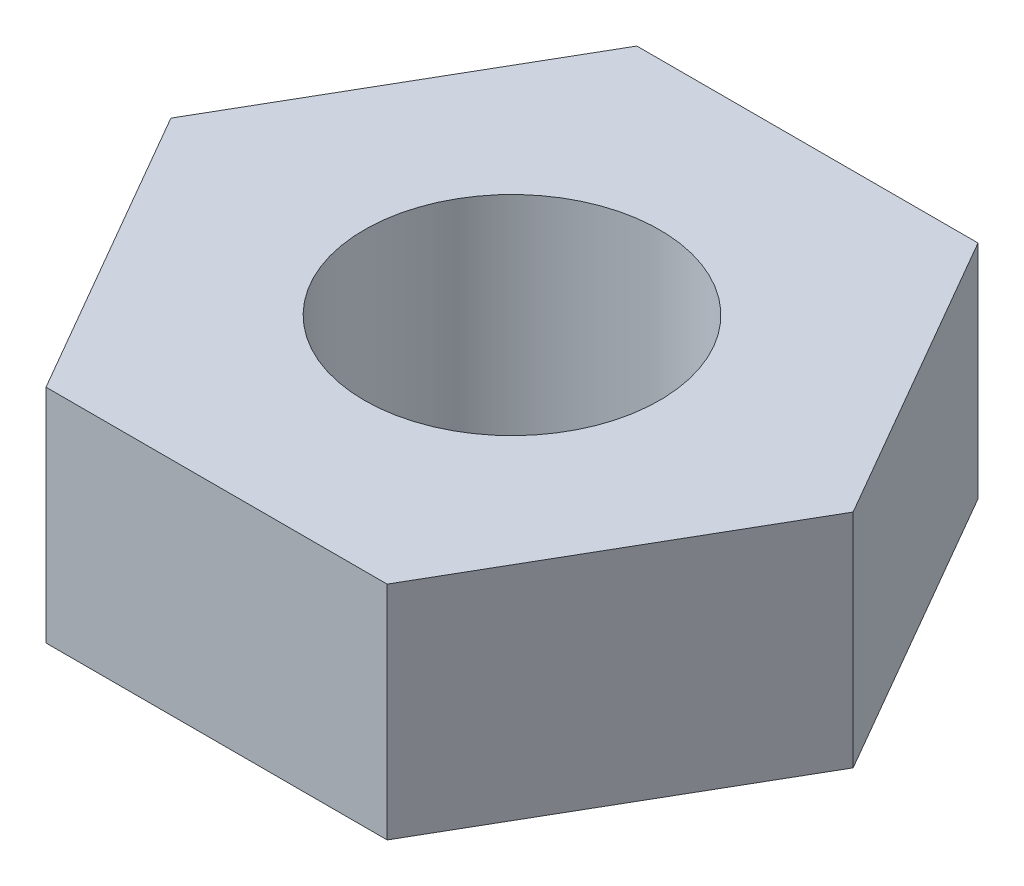
ISO-10303-21;
HEADER;
FILE_DESCRIPTION(('STEP AP214'),'2;1');
FILE_NAME('part.step','',(''),(''),'','','');
FILE_SCHEMA(('AUTOMOTIVE_DESIGN { 1 0 10303 214 1 1 1 1 }'));
ENDSEC;
DATA;
#1=APPLICATION_CONTEXT('core data for automotive mechanical design processes');
#2=APPLICATION_PROTOCOL_DEFINITION('international standard','automotive_design',2000,#1);
#3=PRODUCT_CONTEXT('',#1,'mechanical');
#4=PRODUCT('Part','Part','',(#3));
#5=PRODUCT_RELATED_PRODUCT_CATEGORY('part','',(#4));
#6=PRODUCT_DEFINITION_FORMATION('','',#4);
#7=PRODUCT_DEFINITION_CONTEXT('part definition',#1,'design');
#8=PRODUCT_DEFINITION('design','',#6,#7);
#9=PRODUCT_DEFINITION_SHAPE('','',#8);
#10=(LENGTH_UNIT() NAMED_UNIT(*) SI_UNIT(.MILLI.,.METRE.));
#11=(NAMED_UNIT(*) PLANE_ANGLE_UNIT() SI_UNIT($,.RADIAN.));
#12=(NAMED_UNIT(*) SI_UNIT($,.STERADIAN.) SOLID_ANGLE_UNIT());
#13=UNCERTAINTY_MEASURE_WITH_UNIT(LENGTH_MEASURE(1.E-05),#10,'distance_accuracy_value','');
#14=(GEOMETRIC_REPRESENTATION_CONTEXT(3) GLOBAL_UNCERTAINTY_ASSIGNED_CONTEXT((#13)) GLOBAL_UNIT_ASSIGNED_CONTEXT((#10,
#11,#12)) REPRESENTATION_CONTEXT('',''));
#15=CARTESIAN_POINT('',(0.,0.,0.));
#16=DIRECTION('',(0.,0.,1.));
#17=DIRECTION('',(1.,0.,0.));
#18=AXIS2_PLACEMENT_3D('',#15,#16,#17);
#19=CARTESIAN_POINT('',(0.,1.5,0.));
#20=DIRECTION('',(0.,1.,0.));
#21=DIRECTION('',(0.,0.,1.));
#22=AXIS2_PLACEMENT_3D('',#19,#20,#21);
#23=PLANE('',#22);
#24=DIRECTION('',(0.499999999999999,0.,-0.866025403784439));
#25=VECTOR('',#24,1.);
#26=CARTESIAN_POINT('',(1.15470053837925,1.5,2.));
#27=LINE('',#26,#25);
#28=CARTESIAN_POINT('',(1.15470053837925,1.5,2.));
#29=VERTEX_POINT('',#28);
#30=CARTESIAN_POINT('',(2.3094010767585,1.5,0.));
#31=VERTEX_POINT('',#30);
#32=EDGE_CURVE('E146',#29,#31,#27,.T.);
#33=ORIENTED_EDGE('',*,*,#32,.T.);
#34=DIRECTION('',(-0.5,0.,-0.866025403784439));
#35=VECTOR('',#34,1.);
#36=CARTESIAN_POINT('',(2.3094010767585,1.5,0.));
#37=LINE('',#36,#35);
#38=CARTESIAN_POINT('',(1.15470053837925,1.5,-2.));
#39=VERTEX_POINT('',#38);
#40=EDGE_CURVE('E94',#31,#39,#37,.T.);
#41=ORIENTED_EDGE('',*,*,#40,.T.);
#42=DIRECTION('',(-1.,0.,0.));
#43=VECTOR('',#42,1.);
#44=CARTESIAN_POINT('',(1.15470053837925,1.5,-2.));
#45=LINE('',#44,#43);
#46=CARTESIAN_POINT('',(-1.15470053837925,1.5,-2.));
#47=VERTEX_POINT('',#46);
#48=EDGE_CURVE('E107',#39,#47,#45,.T.);
#49=ORIENTED_EDGE('',*,*,#48,.T.);
#50=DIRECTION('',(-0.5,0.,0.866025403784439));
#51=VECTOR('',#50,1.);
#52=CARTESIAN_POINT('',(-1.15470053837925,1.5,-2.));
#53=LINE('',#52,#51);
#54=CARTESIAN_POINT('',(-2.3094010767585,1.5,0.));
#55=VERTEX_POINT('',#54);
#56=EDGE_CURVE('E101',#47,#55,#53,.T.);
#57=ORIENTED_EDGE('',*,*,#56,.T.);
#58=DIRECTION('',(0.5,0.,0.866025403784439));
#59=VECTOR('',#58,1.);
#60=CARTESIAN_POINT('',(-2.3094010767585,1.5,0.));
#61=LINE('',#60,#59);
#62=CARTESIAN_POINT('',(-1.15470053837925,1.5,2.));
#63=VERTEX_POINT('',#62);
#64=EDGE_CURVE('E105',#55,#63,#61,.T.);
#65=ORIENTED_EDGE('',*,*,#64,.T.);
#66=DIRECTION('',(1.,0.,0.));
#67=VECTOR('',#66,1.);
#68=CARTESIAN_POINT('',(-1.15470053837925,1.5,2.));
#69=LINE('',#68,#67);
#70=EDGE_CURVE('E57',#63,#29,#69,.T.);
#71=ORIENTED_EDGE('',*,*,#70,.T.);
#72=EDGE_LOOP('',(#33,#41,#49,#57,#65,#71));
#73=FACE_BOUND('',#72,.T.);
#74=CARTESIAN_POINT('',(0.,1.5,0.));
#75=DIRECTION('',(0.,1.,0.));
#76=DIRECTION('',(0.,0.,1.));
#77=AXIS2_PLACEMENT_3D('',#74,#75,#76);
#78=CIRCLE('',#77,1.);
#79=CARTESIAN_POINT('',(0.,1.5,1.));
#80=VERTEX_POINT('',#79);
#81=EDGE_CURVE('E134',#80,#80,#78,.T.);
#82=ORIENTED_EDGE('',*,*,#81,.F.);
#83=EDGE_LOOP('',(#82));
#84=FACE_BOUND('',#83,.T.);
#85=ADVANCED_FACE('F39',(#73,#84),#23,.T.);
#86=CARTESIAN_POINT('',(0.,0.,0.));
#87=DIRECTION('',(0.,1.,0.));
#88=DIRECTION('',(0.,0.,1.));
#89=AXIS2_PLACEMENT_3D('',#86,#87,#88);
#90=PLANE('',#89);
#91=DIRECTION('',(0.499999999999999,0.,-0.866025403784439));
#92=VECTOR('',#91,1.);
#93=CARTESIAN_POINT('',(1.15470053837925,0.,2.));
#94=LINE('',#93,#92);
#95=CARTESIAN_POINT('',(1.15470053837925,0.,2.));
#96=VERTEX_POINT('',#95);
#97=CARTESIAN_POINT('',(2.3094010767585,0.,0.));
#98=VERTEX_POINT('',#97);
#99=EDGE_CURVE('E129',#96,#98,#94,.T.);
#100=ORIENTED_EDGE('',*,*,#99,.F.);
#101=DIRECTION('',(1.,0.,0.));
#102=VECTOR('',#101,1.);
#103=CARTESIAN_POINT('',(-1.15470053837925,0.,2.));
#104=LINE('',#103,#102);
#105=CARTESIAN_POINT('',(-1.15470053837925,0.,2.));
#106=VERTEX_POINT('',#105);
#107=EDGE_CURVE('E86',#106,#96,#104,.T.);
#108=ORIENTED_EDGE('',*,*,#107,.F.);
#109=DIRECTION('',(0.5,0.,0.866025403784439));
#110=VECTOR('',#109,1.);
#111=CARTESIAN_POINT('',(-2.3094010767585,0.,0.));
#112=LINE('',#111,#110);
#113=CARTESIAN_POINT('',(-2.3094010767585,0.,0.));
#114=VERTEX_POINT('',#113);
#115=EDGE_CURVE('E80',#114,#106,#112,.T.);
#116=ORIENTED_EDGE('',*,*,#115,.F.);
#117=DIRECTION('',(-0.5,0.,0.866025403784439));
#118=VECTOR('',#117,1.);
#119=CARTESIAN_POINT('',(-1.15470053837925,0.,-2.));
#120=LINE('',#119,#118);
#121=CARTESIAN_POINT('',(-1.15470053837925,0.,-2.));
#122=VERTEX_POINT('',#121);
#123=EDGE_CURVE('E116',#122,#114,#120,.T.);
#124=ORIENTED_EDGE('',*,*,#123,.F.);
#125=DIRECTION('',(-1.,0.,0.));
#126=VECTOR('',#125,1.);
#127=CARTESIAN_POINT('',(1.15470053837925,0.,-2.));
#128=LINE('',#127,#126);
#129=CARTESIAN_POINT('',(1.15470053837925,0.,-2.));
#130=VERTEX_POINT('',#129);
#131=EDGE_CURVE('E137',#130,#122,#128,.T.);
#132=ORIENTED_EDGE('',*,*,#131,.F.);
#133=DIRECTION('',(-0.5,0.,-0.866025403784439));
#134=VECTOR('',#133,1.);
#135=CARTESIAN_POINT('',(2.3094010767585,0.,0.));
#136=LINE('',#135,#134);
#137=EDGE_CURVE('E133',#98,#130,#136,.T.);
#138=ORIENTED_EDGE('',*,*,#137,.F.);
#139=EDGE_LOOP('',(#100,#108,#116,#124,#132,#138));
#140=FACE_BOUND('',#139,.T.);
#141=CARTESIAN_POINT('',(0.,0.,0.));
#142=DIRECTION('',(0.,1.,0.));
#143=DIRECTION('',(0.,0.,1.));
#144=AXIS2_PLACEMENT_3D('',#141,#142,#143);
#145=CIRCLE('',#144,1.);
#146=CARTESIAN_POINT('',(0.,0.,1.));
#147=VERTEX_POINT('',#146);
#148=EDGE_CURVE('E243',#147,#147,#145,.T.);
#149=ORIENTED_EDGE('',*,*,#148,.T.);
#150=EDGE_LOOP('',(#149));
#151=FACE_BOUND('',#150,.T.);
#152=ADVANCED_FACE('F159',(#140,#151),#90,.F.);
#153=CARTESIAN_POINT('',(1.15470053837925,1.5,2.));
#154=DIRECTION('',(-0.866025403784439,0.,-0.499999999999999));
#155=DIRECTION('',(-0.499999999999999,0.,0.866025403784439));
#156=AXIS2_PLACEMENT_3D('',#153,#154,#155);
#157=PLANE('',#156);
#158=ORIENTED_EDGE('',*,*,#99,.T.);
#159=DIRECTION('',(0.,-1.,0.));
#160=VECTOR('',#159,1.);
#161=CARTESIAN_POINT('',(2.3094010767585,1.5,0.));
#162=LINE('',#161,#160);
#163=EDGE_CURVE('E11',#31,#98,#162,.T.);
#164=ORIENTED_EDGE('',*,*,#163,.F.);
#165=ORIENTED_EDGE('',*,*,#32,.F.);
#166=DIRECTION('',(0.,-1.,0.));
#167=VECTOR('',#166,1.);
#168=CARTESIAN_POINT('',(1.15470053837925,1.5,2.));
#169=LINE('',#168,#167);
#170=EDGE_CURVE('E125',#29,#96,#169,.T.);
#171=ORIENTED_EDGE('',*,*,#170,.T.);
#172=EDGE_LOOP('',(#158,#164,#165,#171));
#173=FACE_BOUND('',#172,.T.);
#174=ADVANCED_FACE('F41',(#173),#157,.F.);
#175=CARTESIAN_POINT('',(2.3094010767585,1.5,0.));
#176=DIRECTION('',(-0.866025403784438,0.,0.5));
#177=DIRECTION('',(0.5,0.,0.866025403784439));
#178=AXIS2_PLACEMENT_3D('',#175,#176,#177);
#179=PLANE('',#178);
#180=ORIENTED_EDGE('',*,*,#137,.T.);
#181=DIRECTION('',(0.,-1.,0.));
#182=VECTOR('',#181,1.);
#183=CARTESIAN_POINT('',(1.15470053837925,1.5,-2.));
#184=LINE('',#183,#182);
#185=EDGE_CURVE('E49',#39,#130,#184,.T.);
#186=ORIENTED_EDGE('',*,*,#185,.F.);
#187=ORIENTED_EDGE('',*,*,#40,.F.);
#188=ORIENTED_EDGE('',*,*,#163,.T.);
#189=EDGE_LOOP('',(#180,#186,#187,#188));
#190=FACE_BOUND('',#189,.T.);
#191=ADVANCED_FACE('F184',(#190),#179,.F.);
#192=CARTESIAN_POINT('',(1.15470053837925,1.5,-2.));
#193=DIRECTION('',(0.,0.,1.));
#194=DIRECTION('',(1.,0.,0.));
#195=AXIS2_PLACEMENT_3D('',#192,#193,#194);
#196=PLANE('',#195);
#197=ORIENTED_EDGE('',*,*,#131,.T.);
#198=DIRECTION('',(0.,-1.,0.));
#199=VECTOR('',#198,1.);
#200=CARTESIAN_POINT('',(-1.15470053837925,1.5,-2.));
#201=LINE('',#200,#199);
#202=EDGE_CURVE('E118',#47,#122,#201,.T.);
#203=ORIENTED_EDGE('',*,*,#202,.F.);
#204=ORIENTED_EDGE('',*,*,#48,.F.);
#205=ORIENTED_EDGE('',*,*,#185,.T.);
#206=EDGE_LOOP('',(#197,#203,#204,#205));
#207=FACE_BOUND('',#206,.T.);
#208=ADVANCED_FACE('F156',(#207),#196,.F.);
#209=CARTESIAN_POINT('',(-1.15470053837925,1.5,-2.));
#210=DIRECTION('',(0.866025403784439,0.,0.5));
#211=DIRECTION('',(0.5,0.,-0.866025403784439));
#212=AXIS2_PLACEMENT_3D('',#209,#210,#211);
#213=PLANE('',#212);
#214=ORIENTED_EDGE('',*,*,#123,.T.);
#215=DIRECTION('',(0.,-1.,0.));
#216=VECTOR('',#215,1.);
#217=CARTESIAN_POINT('',(-2.3094010767585,1.5,0.));
#218=LINE('',#217,#216);
#219=EDGE_CURVE('E113',#55,#114,#218,.T.);
#220=ORIENTED_EDGE('',*,*,#219,.F.);
#221=ORIENTED_EDGE('',*,*,#56,.F.);
#222=ORIENTED_EDGE('',*,*,#202,.T.);
#223=EDGE_LOOP('',(#214,#220,#221,#222));
#224=FACE_BOUND('',#223,.T.);
#225=ADVANCED_FACE('F114',(#224),#213,.F.);
#226=CARTESIAN_POINT('',(-2.3094010767585,1.5,0.));
#227=DIRECTION('',(0.866025403784439,0.,-0.5));
#228=DIRECTION('',(-0.5,0.,-0.866025403784439));
#229=AXIS2_PLACEMENT_3D('',#226,#227,#228);
#230=PLANE('',#229);
#231=ORIENTED_EDGE('',*,*,#115,.T.);
#232=DIRECTION('',(0.,-1.,0.));
#233=VECTOR('',#232,1.);
#234=CARTESIAN_POINT('',(-1.15470053837925,1.5,2.));
#235=LINE('',#234,#233);
#236=EDGE_CURVE('E119',#63,#106,#235,.T.);
#237=ORIENTED_EDGE('',*,*,#236,.F.);
#238=ORIENTED_EDGE('',*,*,#64,.F.);
#239=ORIENTED_EDGE('',*,*,#219,.T.);
#240=EDGE_LOOP('',(#231,#237,#238,#239));
#241=FACE_BOUND('',#240,.T.);
#242=ADVANCED_FACE('F121',(#241),#230,.F.);
#243=CARTESIAN_POINT('',(-1.15470053837925,1.5,2.));
#244=DIRECTION('',(0.,0.,-1.));
#245=DIRECTION('',(-1.,0.,0.));
#246=AXIS2_PLACEMENT_3D('',#243,#244,#245);
#247=PLANE('',#246);
#248=ORIENTED_EDGE('',*,*,#107,.T.);
#249=ORIENTED_EDGE('',*,*,#170,.F.);
#250=ORIENTED_EDGE('',*,*,#70,.F.);
#251=ORIENTED_EDGE('',*,*,#236,.T.);
#252=EDGE_LOOP('',(#248,#249,#250,#251));
#253=FACE_BOUND('',#252,.T.);
#254=ADVANCED_FACE('F164',(#253),#247,.F.);
#255=CARTESIAN_POINT('',(0.,1.5,0.));
#256=DIRECTION('',(0.,-1.,0.));
#257=DIRECTION('',(0.,0.,-1.));
#258=AXIS2_PLACEMENT_3D('',#255,#256,#257);
#259=CYLINDRICAL_SURFACE('',#258,1.);
#260=ORIENTED_EDGE('',*,*,#81,.T.);
#261=EDGE_LOOP('',(#260));
#262=FACE_BOUND('',#261,.T.);
#263=ORIENTED_EDGE('',*,*,#148,.F.);
#264=EDGE_LOOP('',(#263));
#265=FACE_BOUND('',#264,.T.);
#266=ADVANCED_FACE('F166',(#262,#265),#259,.F.);
#267=CLOSED_SHELL('',(#85,#152,#174,#191,#208,#225,#242,#254,#266));
#268=MANIFOLD_SOLID_BREP('B2',#267);
#269=ADVANCED_BREP_SHAPE_REPRESENTATION('',(#18,#268),#14);
#270=SHAPE_DEFINITION_REPRESENTATION(#9,#269);
ENDSEC;
END-ISO-10303-21;
